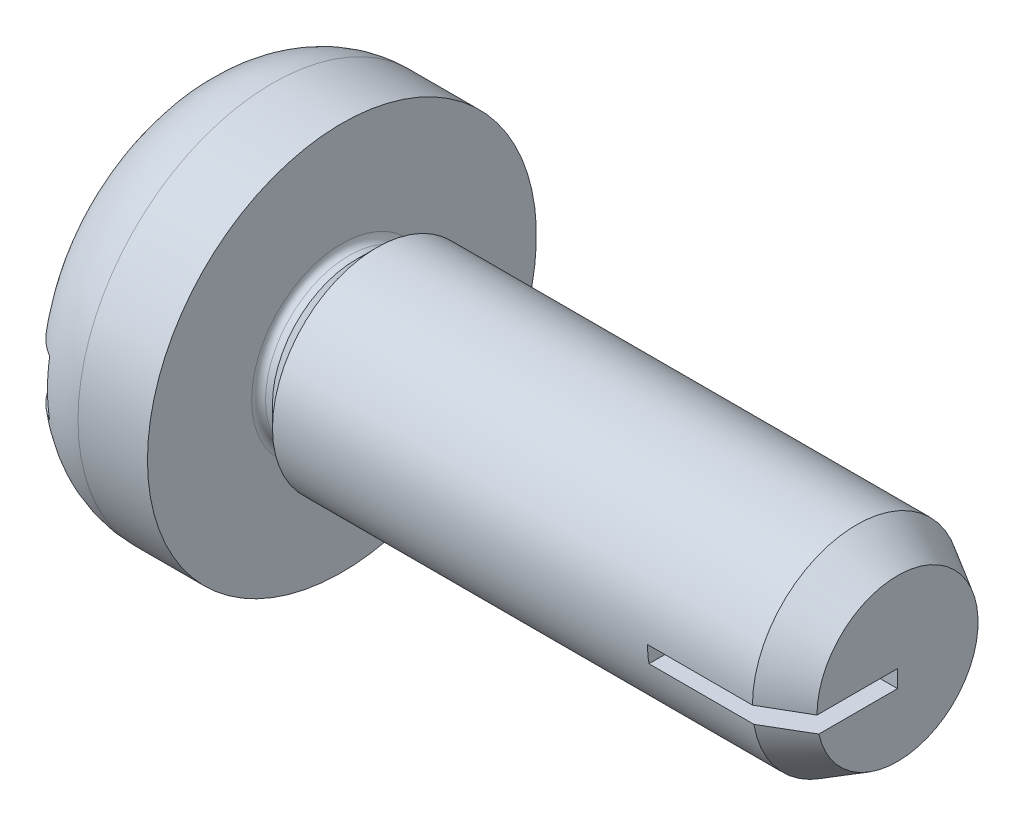
ISO-10303-21;
HEADER;
FILE_DESCRIPTION(('STEP AP214'),'2;1');
FILE_NAME('part.step','',(''),(''),'','','');
FILE_SCHEMA(('AUTOMOTIVE_DESIGN { 1 0 10303 214 1 1 1 1 }'));
ENDSEC;
DATA;
#1=APPLICATION_CONTEXT('core data for automotive mechanical design processes');
#2=APPLICATION_PROTOCOL_DEFINITION('international standard','automotive_design',2000,#1);
#3=PRODUCT_CONTEXT('',#1,'mechanical');
#4=PRODUCT('Part','Part','',(#3));
#5=PRODUCT_RELATED_PRODUCT_CATEGORY('part','',(#4));
#6=PRODUCT_DEFINITION_FORMATION('','',#4);
#7=PRODUCT_DEFINITION_CONTEXT('part definition',#1,'design');
#8=PRODUCT_DEFINITION('design','',#6,#7);
#9=PRODUCT_DEFINITION_SHAPE('','',#8);
#10=(LENGTH_UNIT() NAMED_UNIT(*) SI_UNIT(.MILLI.,.METRE.));
#11=(NAMED_UNIT(*) PLANE_ANGLE_UNIT() SI_UNIT($,.RADIAN.));
#12=(NAMED_UNIT(*) SI_UNIT($,.STERADIAN.) SOLID_ANGLE_UNIT());
#13=UNCERTAINTY_MEASURE_WITH_UNIT(LENGTH_MEASURE(1.E-05),#10,'distance_accuracy_value','');
#14=(GEOMETRIC_REPRESENTATION_CONTEXT(3) GLOBAL_UNCERTAINTY_ASSIGNED_CONTEXT((#13)) GLOBAL_UNIT_ASSIGNED_CONTEXT((#10,
#11,#12)) REPRESENTATION_CONTEXT('',''));
#15=CARTESIAN_POINT('',(0.,0.,0.));
#16=DIRECTION('',(0.,0.,1.));
#17=DIRECTION('',(1.,0.,0.));
#18=AXIS2_PLACEMENT_3D('',#15,#16,#17);
#19=CARTESIAN_POINT('',(0.,0.,0.));
#20=DIRECTION('',(-1.,0.,0.));
#21=DIRECTION('',(0.,0.,1.));
#22=AXIS2_PLACEMENT_3D('',#19,#20,#21);
#23=CYLINDRICAL_SURFACE('',#22,1.5);
#24=CARTESIAN_POINT('',(2.7,0.,0.));
#25=DIRECTION('',(-1.,0.,0.));
#26=DIRECTION('',(0.,0.,1.));
#27=AXIS2_PLACEMENT_3D('',#24,#25,#26);
#28=CIRCLE('',#27,1.5);
#29=CARTESIAN_POINT('',(2.7,0.,1.5));
#30=VERTEX_POINT('',#29);
#31=EDGE_CURVE('E190',#30,#30,#28,.T.);
#32=ORIENTED_EDGE('',*,*,#31,.F.);
#33=EDGE_LOOP('',(#32));
#34=FACE_BOUND('',#33,.T.);
#35=DIRECTION('',(-1.,0.,0.));
#36=VECTOR('',#35,1.);
#37=CARTESIAN_POINT('',(0.,0.,1.5));
#38=LINE('',#37,#36);
#39=CARTESIAN_POINT('',(9.61110272542657,0.,1.5));
#40=VERTEX_POINT('',#39);
#41=CARTESIAN_POINT('',(8.1,0.,1.5));
#42=VERTEX_POINT('',#41);
#43=EDGE_CURVE('E294',#40,#42,#38,.T.);
#44=ORIENTED_EDGE('',*,*,#43,.F.);
#45=CARTESIAN_POINT('',(9.61110272542657,0.,0.));
#46=DIRECTION('',(-1.,0.,0.));
#47=DIRECTION('',(0.,0.,1.));
#48=AXIS2_PLACEMENT_3D('',#45,#46,#47);
#49=CIRCLE('',#48,1.5);
#50=CARTESIAN_POINT('',(9.61110272542657,-0.25,1.4790199457749));
#51=VERTEX_POINT('',#50);
#52=EDGE_CURVE('E290',#40,#51,#49,.T.);
#53=ORIENTED_EDGE('',*,*,#52,.T.);
#54=DIRECTION('',(-1.,0.,0.));
#55=VECTOR('',#54,1.);
#56=CARTESIAN_POINT('',(0.,-0.250000000000001,1.4790199457749));
#57=LINE('',#56,#55);
#58=CARTESIAN_POINT('',(8.1,-0.25,1.4790199457749));
#59=VERTEX_POINT('',#58);
#60=EDGE_CURVE('E300',#59,#51,#57,.F.);
#61=ORIENTED_EDGE('',*,*,#60,.F.);
#62=CARTESIAN_POINT('',(8.1,0.,0.));
#63=DIRECTION('',(1.,0.,0.));
#64=DIRECTION('',(0.,0.,-1.));
#65=AXIS2_PLACEMENT_3D('',#62,#63,#64);
#66=CIRCLE('',#65,1.5);
#67=EDGE_CURVE('E52',#42,#59,#66,.T.);
#68=ORIENTED_EDGE('',*,*,#67,.F.);
#69=EDGE_LOOP('',(#44,#53,#61,#68));
#70=FACE_BOUND('',#69,.T.);
#71=ADVANCED_FACE('F80',(#34,#70),#23,.T.);
#72=CARTESIAN_POINT('',(9.61110272542657,0.,0.));
#73=DIRECTION('',(-1.,0.,0.));
#74=DIRECTION('',(0.,0.,1.));
#75=AXIS2_PLACEMENT_3D('',#72,#73,#74);
#76=CONICAL_SURFACE('',#75,1.5,0.523598775598292);
#77=ORIENTED_EDGE('',*,*,#52,.F.);
#78=DIRECTION('',(-0.866025403784442,0.,0.499999999999994));
#79=VECTOR('',#78,1.);
#80=CARTESIAN_POINT('',(12.2091789367799,0.,0.));
#81=LINE('',#80,#79);
#82=CARTESIAN_POINT('',(10.2,0.,1.16));
#83=VERTEX_POINT('',#82);
#84=EDGE_CURVE('E297',#40,#83,#81,.F.);
#85=ORIENTED_EDGE('',*,*,#84,.T.);
#86=CARTESIAN_POINT('',(10.2,0.,0.));
#87=DIRECTION('',(-1.,0.,0.));
#88=DIRECTION('',(0.,0.,1.));
#89=AXIS2_PLACEMENT_3D('',#86,#87,#88);
#90=CIRCLE('',#89,1.16);
#91=CARTESIAN_POINT('',(10.2,-0.25,1.13274004078606));
#92=VERTEX_POINT('',#91);
#93=EDGE_CURVE('E172',#83,#92,#90,.T.);
#94=ORIENTED_EDGE('',*,*,#93,.T.);
#95=CARTESIAN_POINT('',(11.4181418569732,-0.25,0.382203986386484));
#96=CARTESIAN_POINT('',(11.3972331951244,-0.25,0.396622432472532));
#97=CARTESIAN_POINT('',(11.3762173616021,-0.25,0.410883489403973));
#98=CARTESIAN_POINT('',(11.3340175932902,-0.25,0.439152569856274));
#99=CARTESIAN_POINT('',(11.3128336672864,-0.25,0.453160606478109));
#100=CARTESIAN_POINT('',(11.2491017012437,-0.25,0.494896164896427));
#101=CARTESIAN_POINT('',(11.2063676697051,-0.25,0.522339085516597));
#102=CARTESIAN_POINT('',(11.1206044012544,-0.25,0.576735461075968));
#103=CARTESIAN_POINT('',(11.0775752335605,-0.25,0.603689025716696));
#104=CARTESIAN_POINT('',(10.9913095492911,-0.25,0.657266142328873));
#105=CARTESIAN_POINT('',(10.9480730235488,-0.25,0.683889679520686));
#106=CARTESIAN_POINT('',(10.8218598791878,-0.25,0.761143065792756));
#107=CARTESIAN_POINT('',(10.7386947451298,-0.25,0.81146450763557));
#108=CARTESIAN_POINT('',(10.5720741029365,-0.25,0.911624729010411));
#109=CARTESIAN_POINT('',(10.488618591502,-0.25,0.961463503033986));
#110=CARTESIAN_POINT('',(10.23795252732,-0.25,1.11055290730823));
#111=CARTESIAN_POINT('',(10.0704761356872,-0.25,1.20935625450731));
#112=CARTESIAN_POINT('',(9.77526163481782,-0.25,1.3828718387951));
#113=CARTESIAN_POINT('',(9.64759083644122,-0.25,1.45769905707308));
#114=CARTESIAN_POINT('',(9.39212620609127,-0.25,1.60714336352689));
#115=CARTESIAN_POINT('',(9.26433237410953,-0.25,1.68176045168836));
#116=CARTESIAN_POINT('',(9.0087172173291,-0.25,1.83082709807697));
#117=CARTESIAN_POINT('',(8.88089592520653,-0.25,1.90527671238543));
#118=CARTESIAN_POINT('',(8.62519555777105,-0.25,2.05407620843158));
#119=CARTESIAN_POINT('',(8.49731648254642,-0.25,2.12842609032095));
#120=CARTESIAN_POINT('',(8.36941931140605,-0.25,2.20274480142775));
#121=B_SPLINE_CURVE_WITH_KNOTS('',3,(#95,#96,#97,#98,#99,#100,#101,#102,#103,#104,#105,#106,
#107,#108,#109,#110,#111,#112,#113,#114,#115,#116,#117,#118,#119,#120),.UNSPECIFIED.,.F.,.F.,(4,
2,2,2,2,2,2,2,2,2,2,2,4),(0.,0.0761919627966669,0.152379969123876,0.304734924671154,
0.457055293432604,0.609382459099721,0.900992098244172,1.19260506147505,1.77594908814433,
2.2198978958494,2.6638467338862,3.10761381509469,3.55138022062236),.UNSPECIFIED.);
#122=EDGE_CURVE('E303',#92,#51,#121,.T.);
#123=ORIENTED_EDGE('',*,*,#122,.T.);
#124=EDGE_LOOP('',(#77,#85,#94,#123));
#125=FACE_BOUND('',#124,.T.);
#126=ADVANCED_FACE('F247',(#125),#76,.T.);
#127=CARTESIAN_POINT('',(10.2,1.5,0.));
#128=DIRECTION('',(-1.,0.,0.));
#129=DIRECTION('',(0.,0.,1.));
#130=AXIS2_PLACEMENT_3D('',#127,#128,#129);
#131=PLANE('',#130);
#132=DIRECTION('',(0.,0.,1.));
#133=VECTOR('',#132,1.);
#134=CARTESIAN_POINT('',(10.2,0.,0.));
#135=LINE('',#134,#133);
#136=CARTESIAN_POINT('',(10.2,0.,0.));
#137=VERTEX_POINT('',#136);
#138=EDGE_CURVE('E89',#137,#83,#135,.T.);
#139=ORIENTED_EDGE('',*,*,#138,.F.);
#140=DIRECTION('',(0.,1.,0.));
#141=VECTOR('',#140,1.);
#142=CARTESIAN_POINT('',(10.2,0.,0.));
#143=LINE('',#142,#141);
#144=CARTESIAN_POINT('',(10.2,-0.25,0.));
#145=VERTEX_POINT('',#144);
#146=EDGE_CURVE('E162',#145,#137,#143,.T.);
#147=ORIENTED_EDGE('',*,*,#146,.F.);
#148=DIRECTION('',(0.,0.,-1.));
#149=VECTOR('',#148,1.);
#150=CARTESIAN_POINT('',(10.2,-0.25,0.));
#151=LINE('',#150,#149);
#152=EDGE_CURVE('E174',#92,#145,#151,.T.);
#153=ORIENTED_EDGE('',*,*,#152,.F.);
#154=ORIENTED_EDGE('',*,*,#93,.F.);
#155=EDGE_LOOP('',(#139,#147,#153,#154));
#156=FACE_BOUND('',#155,.T.);
#157=ADVANCED_FACE('F82',(#156),#131,.F.);
#158=CARTESIAN_POINT('',(0.,0.,0.));
#159=DIRECTION('',(1.,0.,0.));
#160=DIRECTION('',(0.,0.,-1.));
#161=AXIS2_PLACEMENT_3D('',#158,#159,#160);
#162=PLANE('',#161);
#163=CARTESIAN_POINT('',(0.,0.,0.));
#164=DIRECTION('',(-1.,0.,0.));
#165=DIRECTION('',(0.,0.,1.));
#166=AXIS2_PLACEMENT_3D('',#163,#164,#165);
#167=CIRCLE('',#166,1.6);
#168=CARTESIAN_POINT('',(0.,0.4,1.54919333848297));
#169=VERTEX_POINT('',#168);
#170=CARTESIAN_POINT('',(0.,0.4,-1.54919333848297));
#171=VERTEX_POINT('',#170);
#172=EDGE_CURVE('E214',#169,#171,#167,.T.);
#173=ORIENTED_EDGE('',*,*,#172,.T.);
#174=DIRECTION('',(0.,0.,1.));
#175=VECTOR('',#174,1.);
#176=CARTESIAN_POINT('',(0.,0.4,0.));
#177=LINE('',#176,#175);
#178=EDGE_CURVE('E183',#171,#169,#177,.T.);
#179=ORIENTED_EDGE('',*,*,#178,.T.);
#180=EDGE_LOOP('',(#173,#179));
#181=FACE_BOUND('',#180,.T.);
#182=ADVANCED_FACE('F337',(#181),#162,.F.);
#183=CARTESIAN_POINT('',(2.7,0.,0.));
#184=DIRECTION('',(1.,0.,0.));
#185=DIRECTION('',(0.,0.,-1.));
#186=AXIS2_PLACEMENT_3D('',#183,#184,#185);
#187=CONICAL_SURFACE('',#186,1.5,0.78539816339745);
#188=CARTESIAN_POINT('',(2.4,0.,0.));
#189=DIRECTION('',(-1.,0.,0.));
#190=DIRECTION('',(0.,0.,1.));
#191=AXIS2_PLACEMENT_3D('',#188,#189,#190);
#192=CIRCLE('',#191,1.2);
#193=CARTESIAN_POINT('',(2.4,0.,1.2));
#194=VERTEX_POINT('',#193);
#195=EDGE_CURVE('E194',#194,#194,#192,.T.);
#196=ORIENTED_EDGE('',*,*,#195,.F.);
#197=EDGE_LOOP('',(#196));
#198=FACE_BOUND('',#197,.T.);
#199=ORIENTED_EDGE('',*,*,#31,.T.);
#200=EDGE_LOOP('',(#199));
#201=FACE_BOUND('',#200,.T.);
#202=ADVANCED_FACE('F333',(#198,#201),#187,.T.);
#203=CARTESIAN_POINT('',(0.,0.,0.));
#204=DIRECTION('',(-1.,0.,0.));
#205=DIRECTION('',(0.,0.,1.));
#206=AXIS2_PLACEMENT_3D('',#203,#204,#205);
#207=CYLINDRICAL_SURFACE('',#206,1.2);
#208=CARTESIAN_POINT('',(2.3,0.,0.));
#209=DIRECTION('',(-1.,0.,0.));
#210=DIRECTION('',(0.,0.,1.));
#211=AXIS2_PLACEMENT_3D('',#208,#209,#210);
#212=CIRCLE('',#211,1.2);
#213=CARTESIAN_POINT('',(2.3,0.,1.2));
#214=VERTEX_POINT('',#213);
#215=EDGE_CURVE('E198',#214,#214,#212,.T.);
#216=ORIENTED_EDGE('',*,*,#215,.F.);
#217=EDGE_LOOP('',(#216));
#218=FACE_BOUND('',#217,.T.);
#219=ORIENTED_EDGE('',*,*,#195,.T.);
#220=EDGE_LOOP('',(#219));
#221=FACE_BOUND('',#220,.T.);
#222=ADVANCED_FACE('F336',(#218,#221),#207,.T.);
#223=CARTESIAN_POINT('',(2.3,0.,0.));
#224=DIRECTION('',(-1.,0.,0.));
#225=DIRECTION('',(0.,0.,1.));
#226=AXIS2_PLACEMENT_3D('',#223,#224,#225);
#227=TOROIDAL_SURFACE('',#226,1.3,0.0999999999999997);
#228=CARTESIAN_POINT('',(2.2,0.,0.));
#229=DIRECTION('',(-1.,0.,0.));
#230=DIRECTION('',(0.,0.,1.));
#231=AXIS2_PLACEMENT_3D('',#228,#229,#230);
#232=CIRCLE('',#231,1.3);
#233=CARTESIAN_POINT('',(2.2,0.,1.3));
#234=VERTEX_POINT('',#233);
#235=EDGE_CURVE('E202',#234,#234,#232,.T.);
#236=ORIENTED_EDGE('',*,*,#235,.F.);
#237=EDGE_LOOP('',(#236));
#238=FACE_BOUND('',#237,.T.);
#239=ORIENTED_EDGE('',*,*,#215,.T.);
#240=EDGE_LOOP('',(#239));
#241=FACE_BOUND('',#240,.T.);
#242=ADVANCED_FACE('F341',(#238,#241),#227,.F.);
#243=CARTESIAN_POINT('',(2.2,2.8,0.));
#244=DIRECTION('',(-1.,0.,0.));
#245=DIRECTION('',(0.,0.,1.));
#246=AXIS2_PLACEMENT_3D('',#243,#244,#245);
#247=PLANE('',#246);
#248=CARTESIAN_POINT('',(2.2,0.,0.));
#249=DIRECTION('',(-1.,0.,0.));
#250=DIRECTION('',(0.,0.,1.));
#251=AXIS2_PLACEMENT_3D('',#248,#249,#250);
#252=CIRCLE('',#251,2.8);
#253=CARTESIAN_POINT('',(2.2,0.,2.8));
#254=VERTEX_POINT('',#253);
#255=EDGE_CURVE('E206',#254,#254,#252,.T.);
#256=ORIENTED_EDGE('',*,*,#255,.F.);
#257=EDGE_LOOP('',(#256));
#258=FACE_BOUND('',#257,.T.);
#259=ORIENTED_EDGE('',*,*,#235,.T.);
#260=EDGE_LOOP('',(#259));
#261=FACE_BOUND('',#260,.T.);
#262=ADVANCED_FACE('F345',(#258,#261),#247,.F.);
#263=CARTESIAN_POINT('',(0.,0.,0.));
#264=DIRECTION('',(-1.,0.,0.));
#265=DIRECTION('',(0.,0.,1.));
#266=AXIS2_PLACEMENT_3D('',#263,#264,#265);
#267=CYLINDRICAL_SURFACE('',#266,2.8);
#268=CARTESIAN_POINT('',(1.2,0.,0.));
#269=DIRECTION('',(-1.,0.,0.));
#270=DIRECTION('',(0.,0.,1.));
#271=AXIS2_PLACEMENT_3D('',#268,#269,#270);
#272=CIRCLE('',#271,2.8);
#273=CARTESIAN_POINT('',(1.2,0.,2.8));
#274=VERTEX_POINT('',#273);
#275=EDGE_CURVE('E210',#274,#274,#272,.T.);
#276=ORIENTED_EDGE('',*,*,#275,.F.);
#277=EDGE_LOOP('',(#276));
#278=FACE_BOUND('',#277,.T.);
#279=ORIENTED_EDGE('',*,*,#255,.T.);
#280=EDGE_LOOP('',(#279));
#281=FACE_BOUND('',#280,.T.);
#282=ADVANCED_FACE('F348',(#278,#281),#267,.T.);
#283=CARTESIAN_POINT('',(1.2,0.,0.));
#284=DIRECTION('',(-1.,0.,0.));
#285=DIRECTION('',(0.,0.,1.));
#286=AXIS2_PLACEMENT_3D('',#283,#284,#285);
#287=TOROIDAL_SURFACE('',#286,1.6,1.2);
#288=CARTESIAN_POINT('',(0.6,0.,0.));
#289=DIRECTION('',(1.,0.,0.));
#290=DIRECTION('',(0.,0.,-1.));
#291=AXIS2_PLACEMENT_3D('',#288,#289,#290);
#292=CIRCLE('',#291,2.63923048454133);
#293=CARTESIAN_POINT('',(0.6,-0.4,-2.60874252285124));
#294=VERTEX_POINT('',#293);
#295=CARTESIAN_POINT('',(0.6,0.4,-2.60874252285124));
#296=VERTEX_POINT('',#295);
#297=EDGE_CURVE('E176',#294,#296,#292,.T.);
#298=ORIENTED_EDGE('',*,*,#297,.T.);
#299=CARTESIAN_POINT('',(1.2,0.4,0.));
#300=CARTESIAN_POINT('',(1.19800002214789,0.4,-0.00115466698871855));
#301=CARTESIAN_POINT('',(1.1960000217345,0.4,-0.00230936827193281));
#302=CARTESIAN_POINT('',(1.07851992928523,0.399999999999999,-0.0701402646469924));
#303=CARTESIAN_POINT('',(0.963031267984437,0.4,-0.137031551756192));
#304=CARTESIAN_POINT('',(0.795628563220693,0.4,-0.246377030383225));
#305=CARTESIAN_POINT('',(0.740832436729923,0.4,-0.284299922840263));
#306=CARTESIAN_POINT('',(0.634300385450462,0.4,-0.364194759563207));
#307=CARTESIAN_POINT('',(0.582562679504804,0.4,-0.406164308913304));
#308=CARTESIAN_POINT('',(0.465619274423474,0.4,-0.510755553519521));
#309=CARTESIAN_POINT('',(0.402179968317596,0.4,-0.57540879176858));
#310=CARTESIAN_POINT('',(0.286317320035686,0.4,-0.714106368628982));
#311=CARTESIAN_POINT('',(0.233897735017528,0.4,-0.788153896456479));
#312=CARTESIAN_POINT('',(0.142797670168301,0.4,-0.945320815266712));
#313=CARTESIAN_POINT('',(0.104252175689236,0.4,-1.02851956722977));
#314=CARTESIAN_POINT('',(0.0443409897927813,0.4,-1.20092725682624));
#315=CARTESIAN_POINT('',(0.0229636760970945,0.4,-1.29013208413619));
#316=CARTESIAN_POINT('',(0.000858314142152574,0.4,-1.4582761752739));
#317=CARTESIAN_POINT('',(-0.00235235719653778,0.4,-1.53689338760874));
#318=CARTESIAN_POINT('',(0.00576054949015224,0.4,-1.69337597661939));
#319=CARTESIAN_POINT('',(0.0170759813003484,0.4,-1.77124175003619));
#320=CARTESIAN_POINT('',(0.0525610257881557,0.4,-1.91696976554059));
#321=CARTESIAN_POINT('',(0.0755565891225386,0.4,-1.9851197953842));
#322=CARTESIAN_POINT('',(0.133093509111277,0.4,-2.11635517467466));
#323=CARTESIAN_POINT('',(0.167631267407019,0.4,-2.17944209498844));
#324=CARTESIAN_POINT('',(0.245816751592905,0.4,-2.29633028651693));
#325=CARTESIAN_POINT('',(0.28908094915115,0.4,-2.35038843477007));
#326=CARTESIAN_POINT('',(0.38422833741794,0.4,-2.45030606079158));
#327=CARTESIAN_POINT('',(0.436111208507158,0.4,-2.49616584246151));
#328=CARTESIAN_POINT('',(0.54597581646141,0.4,-2.5775197041791));
#329=CARTESIAN_POINT('',(0.603828386265241,0.4,-2.61318831704883));
#330=CARTESIAN_POINT('',(0.724733603956612,0.4,-2.67419425683942));
#331=CARTESIAN_POINT('',(0.787785087346299,0.4,-2.69953388981796));
#332=CARTESIAN_POINT('',(0.91666946627424,0.4,-2.73894273624227));
#333=CARTESIAN_POINT('',(0.982470675322364,0.4,-2.75311557094143));
#334=CARTESIAN_POINT('',(1.1155255636707,0.4,-2.7701715048585));
#335=CARTESIAN_POINT('',(1.18277950768768,0.4,-2.77305252873677));
#336=CARTESIAN_POINT('',(1.31654922365011,0.4,-2.76743242821687));
#337=CARTESIAN_POINT('',(1.3830669354009,0.4,-2.75898086367109));
#338=CARTESIAN_POINT('',(1.48103311703034,0.4,-2.73804449298601));
#339=CARTESIAN_POINT('',(1.51341191586074,0.4,-2.72967920848576));
#340=CARTESIAN_POINT('',(1.5773527652736,0.4,-2.71025505840752));
#341=CARTESIAN_POINT('',(1.60891478219557,0.4,-2.69919608201444));
#342=CARTESIAN_POINT('',(1.63997012604846,0.4,-2.68682286567703));
#343=B_SPLINE_CURVE_WITH_KNOTS('',3,(#299,#300,#301,#302,#303,#304,#305,#306,#307,#308,#309,
#310,#311,#312,#313,#314,#315,#316,#317,#318,#319,#320,#321,#322,#323,#324,#325,#326,#327,#328,
#329,#330,#331,#332,#333,#334,#335,#336,#337,#338,#339,#340,#341,#342),.UNSPECIFIED.,.F.,.F.,(4,
2,2,2,2,2,2,2,2,2,2,2,2,2,2,2,2,2,2,2,2,4),(0.,0.00692820323037692,0.406962370716071,
0.606725059471952,0.806370240836196,1.0771229989525,1.34796792064431,1.62138096078601,
1.89460875314745,2.12938467138175,2.36402898515836,2.57873345497427,2.79337105154141,
3.00008219626894,3.20678567692457,3.40970176105923,3.61257251711377,3.81353782319069,
4.01454006326545,4.21466613793784,4.31488940223465,4.41511679028649),.UNSPECIFIED.);
#344=EDGE_CURVE('E229',#296,#171,#343,.F.);
#345=ORIENTED_EDGE('',*,*,#344,.T.);
#346=ORIENTED_EDGE('',*,*,#172,.F.);
#347=CARTESIAN_POINT('',(1.2,0.4,0.));
#348=CARTESIAN_POINT('',(1.19800002214789,0.4,0.00115466698871855));
#349=CARTESIAN_POINT('',(1.1960000217345,0.4,0.00230936827193281));
#350=CARTESIAN_POINT('',(1.07851992928523,0.399999999999999,0.0701402646469924));
#351=CARTESIAN_POINT('',(0.963031267984437,0.4,0.137031551756192));
#352=CARTESIAN_POINT('',(0.795628563220693,0.4,0.246377030383225));
#353=CARTESIAN_POINT('',(0.740832436729923,0.4,0.284299922840263));
#354=CARTESIAN_POINT('',(0.634300385450462,0.4,0.364194759563207));
#355=CARTESIAN_POINT('',(0.582562679504804,0.4,0.406164308913304));
#356=CARTESIAN_POINT('',(0.465619274423474,0.4,0.510755553519521));
#357=CARTESIAN_POINT('',(0.402179968317596,0.4,0.57540879176858));
#358=CARTESIAN_POINT('',(0.286317320035686,0.4,0.714106368628982));
#359=CARTESIAN_POINT('',(0.233897735017528,0.4,0.788153896456479));
#360=CARTESIAN_POINT('',(0.142797670168301,0.4,0.945320815266712));
#361=CARTESIAN_POINT('',(0.104252175689236,0.4,1.02851956722977));
#362=CARTESIAN_POINT('',(0.0443409897927813,0.4,1.20092725682624));
#363=CARTESIAN_POINT('',(0.0229636760970945,0.4,1.29013208413619));
#364=CARTESIAN_POINT('',(0.000858314142152574,0.4,1.4582761752739));
#365=CARTESIAN_POINT('',(-0.00235235719653778,0.4,1.53689338760874));
#366=CARTESIAN_POINT('',(0.00576054949015224,0.4,1.69337597661939));
#367=CARTESIAN_POINT('',(0.0170759813003484,0.4,1.77124175003619));
#368=CARTESIAN_POINT('',(0.0525610257881557,0.4,1.91696976554059));
#369=CARTESIAN_POINT('',(0.0755565891225386,0.4,1.9851197953842));
#370=CARTESIAN_POINT('',(0.133093509111277,0.4,2.11635517467466));
#371=CARTESIAN_POINT('',(0.167631267407019,0.4,2.17944209498844));
#372=CARTESIAN_POINT('',(0.245816751592905,0.4,2.29633028651693));
#373=CARTESIAN_POINT('',(0.28908094915115,0.4,2.35038843477007));
#374=CARTESIAN_POINT('',(0.38422833741794,0.4,2.45030606079158));
#375=CARTESIAN_POINT('',(0.436111208507158,0.4,2.49616584246151));
#376=CARTESIAN_POINT('',(0.54597581646141,0.4,2.5775197041791));
#377=CARTESIAN_POINT('',(0.603828386265241,0.4,2.61318831704883));
#378=CARTESIAN_POINT('',(0.724733603956612,0.4,2.67419425683942));
#379=CARTESIAN_POINT('',(0.787785087346299,0.4,2.69953388981796));
#380=CARTESIAN_POINT('',(0.91666946627424,0.4,2.73894273624227));
#381=CARTESIAN_POINT('',(0.982470675322364,0.4,2.75311557094143));
#382=CARTESIAN_POINT('',(1.1155255636707,0.4,2.7701715048585));
#383=CARTESIAN_POINT('',(1.18277950768768,0.4,2.77305252873677));
#384=CARTESIAN_POINT('',(1.31654922365011,0.4,2.76743242821687));
#385=CARTESIAN_POINT('',(1.3830669354009,0.4,2.75898086367109));
#386=CARTESIAN_POINT('',(1.48103311703034,0.4,2.73804449298601));
#387=CARTESIAN_POINT('',(1.51341191586074,0.4,2.72967920848576));
#388=CARTESIAN_POINT('',(1.5773527652736,0.4,2.71025505840752));
#389=CARTESIAN_POINT('',(1.60891478219557,0.4,2.69919608201444));
#390=CARTESIAN_POINT('',(1.63997012604846,0.4,2.68682286567703));
#391=B_SPLINE_CURVE_WITH_KNOTS('',3,(#347,#348,#349,#350,#351,#352,#353,#354,#355,#356,#357,
#358,#359,#360,#361,#362,#363,#364,#365,#366,#367,#368,#369,#370,#371,#372,#373,#374,#375,#376,
#377,#378,#379,#380,#381,#382,#383,#384,#385,#386,#387,#388,#389,#390),.UNSPECIFIED.,.F.,.F.,(4,
2,2,2,2,2,2,2,2,2,2,2,2,2,2,2,2,2,2,2,2,4),(0.,0.00692820323037692,0.406962370716071,
0.606725059471952,0.806370240836196,1.0771229989525,1.34796792064431,1.62138096078601,
1.89460875314745,2.12938467138175,2.36402898515836,2.57873345497427,2.79337105154141,
3.00008219626894,3.20678567692457,3.40970176105923,3.61257251711377,3.81353782319069,
4.01454006326545,4.21466613793784,4.31488940223465,4.41511679028649),.UNSPECIFIED.);
#392=CARTESIAN_POINT('',(0.6,0.4,2.60874252285124));
#393=VERTEX_POINT('',#392);
#394=EDGE_CURVE('E219',#169,#393,#391,.T.);
#395=ORIENTED_EDGE('',*,*,#394,.T.);
#396=CARTESIAN_POINT('',(0.6,-0.4,2.60874252285124));
#397=VERTEX_POINT('',#396);
#398=EDGE_CURVE('E179',#393,#397,#292,.T.);
#399=ORIENTED_EDGE('',*,*,#398,.T.);
#400=CARTESIAN_POINT('',(1.2,-0.4,0.));
#401=CARTESIAN_POINT('',(1.19800002214789,-0.4,0.00115466698871855));
#402=CARTESIAN_POINT('',(1.1960000217345,-0.4,0.00230936827193281));
#403=CARTESIAN_POINT('',(1.07851992928523,-0.399999999999999,0.0701402646469924));
#404=CARTESIAN_POINT('',(0.963031267984437,-0.4,0.137031551756192));
#405=CARTESIAN_POINT('',(0.795628563220693,-0.4,0.246377030383225));
#406=CARTESIAN_POINT('',(0.740832436729923,-0.4,0.284299922840263));
#407=CARTESIAN_POINT('',(0.634300385450462,-0.4,0.364194759563207));
#408=CARTESIAN_POINT('',(0.582562679504804,-0.4,0.406164308913304));
#409=CARTESIAN_POINT('',(0.465619274423474,-0.4,0.510755553519521));
#410=CARTESIAN_POINT('',(0.402179968317596,-0.4,0.57540879176858));
#411=CARTESIAN_POINT('',(0.286317320035686,-0.4,0.714106368628982));
#412=CARTESIAN_POINT('',(0.233897735017528,-0.4,0.788153896456479));
#413=CARTESIAN_POINT('',(0.142797670168301,-0.4,0.945320815266712));
#414=CARTESIAN_POINT('',(0.104252175689236,-0.4,1.02851956722977));
#415=CARTESIAN_POINT('',(0.0443409897927813,-0.4,1.20092725682624));
#416=CARTESIAN_POINT('',(0.0229636760970945,-0.4,1.29013208413619));
#417=CARTESIAN_POINT('',(0.000858314142152574,-0.4,1.4582761752739));
#418=CARTESIAN_POINT('',(-0.00235235719653778,-0.4,1.53689338760874));
#419=CARTESIAN_POINT('',(0.00576054949015224,-0.4,1.69337597661939));
#420=CARTESIAN_POINT('',(0.0170759813003484,-0.4,1.77124175003619));
#421=CARTESIAN_POINT('',(0.0525610257881557,-0.4,1.91696976554059));
#422=CARTESIAN_POINT('',(0.0755565891225386,-0.4,1.9851197953842));
#423=CARTESIAN_POINT('',(0.133093509111277,-0.4,2.11635517467466));
#424=CARTESIAN_POINT('',(0.167631267407019,-0.4,2.17944209498844));
#425=CARTESIAN_POINT('',(0.245816751592905,-0.4,2.29633028651693));
#426=CARTESIAN_POINT('',(0.28908094915115,-0.4,2.35038843477007));
#427=CARTESIAN_POINT('',(0.38422833741794,-0.4,2.45030606079158));
#428=CARTESIAN_POINT('',(0.436111208507158,-0.4,2.49616584246151));
#429=CARTESIAN_POINT('',(0.54597581646141,-0.4,2.5775197041791));
#430=CARTESIAN_POINT('',(0.603828386265241,-0.4,2.61318831704883));
#431=CARTESIAN_POINT('',(0.724733603956612,-0.4,2.67419425683942));
#432=CARTESIAN_POINT('',(0.787785087346299,-0.4,2.69953388981796));
#433=CARTESIAN_POINT('',(0.91666946627424,-0.4,2.73894273624227));
#434=CARTESIAN_POINT('',(0.982470675322364,-0.4,2.75311557094143));
#435=CARTESIAN_POINT('',(1.1155255636707,-0.4,2.7701715048585));
#436=CARTESIAN_POINT('',(1.18277950768768,-0.4,2.77305252873677));
#437=CARTESIAN_POINT('',(1.31654922365011,-0.4,2.76743242821687));
#438=CARTESIAN_POINT('',(1.3830669354009,-0.4,2.75898086367109));
#439=CARTESIAN_POINT('',(1.48103311703034,-0.4,2.73804449298601));
#440=CARTESIAN_POINT('',(1.51341191586074,-0.4,2.72967920848576));
#441=CARTESIAN_POINT('',(1.5773527652736,-0.4,2.71025505840752));
#442=CARTESIAN_POINT('',(1.60891478219557,-0.4,2.69919608201444));
#443=CARTESIAN_POINT('',(1.63997012604846,-0.4,2.68682286567703));
#444=B_SPLINE_CURVE_WITH_KNOTS('',3,(#400,#401,#402,#403,#404,#405,#406,#407,#408,#409,#410,
#411,#412,#413,#414,#415,#416,#417,#418,#419,#420,#421,#422,#423,#424,#425,#426,#427,#428,#429,
#430,#431,#432,#433,#434,#435,#436,#437,#438,#439,#440,#441,#442,#443),.UNSPECIFIED.,.F.,.F.,(4,
2,2,2,2,2,2,2,2,2,2,2,2,2,2,2,2,2,2,2,2,4),(0.,0.00692820323037692,0.406962370716071,
0.606725059471952,0.806370240836196,1.0771229989525,1.34796792064431,1.62138096078601,
1.89460875314745,2.12938467138175,2.36402898515836,2.57873345497427,2.79337105154141,
3.00008219626894,3.20678567692457,3.40970176105923,3.61257251711377,3.81353782319069,
4.01454006326545,4.21466613793784,4.31488940223465,4.41511679028649),.UNSPECIFIED.);
#445=CARTESIAN_POINT('',(0.,-0.4,1.54919333848297));
#446=VERTEX_POINT('',#445);
#447=EDGE_CURVE('E260',#397,#446,#444,.F.);
#448=ORIENTED_EDGE('',*,*,#447,.T.);
#449=CARTESIAN_POINT('',(0.,-0.4,-1.54919333848297));
#450=VERTEX_POINT('',#449);
#451=EDGE_CURVE('E218',#450,#446,#167,.T.);
#452=ORIENTED_EDGE('',*,*,#451,.F.);
#453=CARTESIAN_POINT('',(1.2,-0.4,0.));
#454=CARTESIAN_POINT('',(1.19800002214789,-0.4,-0.00115466698871855));
#455=CARTESIAN_POINT('',(1.1960000217345,-0.4,-0.00230936827193281));
#456=CARTESIAN_POINT('',(1.07851992928523,-0.399999999999999,-0.0701402646469924));
#457=CARTESIAN_POINT('',(0.963031267984437,-0.4,-0.137031551756192));
#458=CARTESIAN_POINT('',(0.795628563220693,-0.4,-0.246377030383225));
#459=CARTESIAN_POINT('',(0.740832436729923,-0.4,-0.284299922840263));
#460=CARTESIAN_POINT('',(0.634300385450462,-0.4,-0.364194759563207));
#461=CARTESIAN_POINT('',(0.582562679504804,-0.4,-0.406164308913304));
#462=CARTESIAN_POINT('',(0.465619274423474,-0.4,-0.510755553519521));
#463=CARTESIAN_POINT('',(0.402179968317596,-0.4,-0.57540879176858));
#464=CARTESIAN_POINT('',(0.286317320035686,-0.4,-0.714106368628982));
#465=CARTESIAN_POINT('',(0.233897735017528,-0.4,-0.788153896456479));
#466=CARTESIAN_POINT('',(0.142797670168301,-0.4,-0.945320815266712));
#467=CARTESIAN_POINT('',(0.104252175689236,-0.4,-1.02851956722977));
#468=CARTESIAN_POINT('',(0.0443409897927813,-0.4,-1.20092725682624));
#469=CARTESIAN_POINT('',(0.0229636760970945,-0.4,-1.29013208413619));
#470=CARTESIAN_POINT('',(0.000858314142152574,-0.4,-1.4582761752739));
#471=CARTESIAN_POINT('',(-0.00235235719653778,-0.4,-1.53689338760874));
#472=CARTESIAN_POINT('',(0.00576054949015224,-0.4,-1.69337597661939));
#473=CARTESIAN_POINT('',(0.0170759813003484,-0.4,-1.77124175003619));
#474=CARTESIAN_POINT('',(0.0525610257881557,-0.4,-1.91696976554059));
#475=CARTESIAN_POINT('',(0.0755565891225386,-0.4,-1.9851197953842));
#476=CARTESIAN_POINT('',(0.133093509111277,-0.4,-2.11635517467466));
#477=CARTESIAN_POINT('',(0.167631267407019,-0.4,-2.17944209498844));
#478=CARTESIAN_POINT('',(0.245816751592905,-0.4,-2.29633028651693));
#479=CARTESIAN_POINT('',(0.28908094915115,-0.4,-2.35038843477007));
#480=CARTESIAN_POINT('',(0.38422833741794,-0.4,-2.45030606079158));
#481=CARTESIAN_POINT('',(0.436111208507158,-0.4,-2.49616584246151));
#482=CARTESIAN_POINT('',(0.54597581646141,-0.4,-2.5775197041791));
#483=CARTESIAN_POINT('',(0.603828386265241,-0.4,-2.61318831704883));
#484=CARTESIAN_POINT('',(0.724733603956612,-0.4,-2.67419425683942));
#485=CARTESIAN_POINT('',(0.787785087346299,-0.4,-2.69953388981796));
#486=CARTESIAN_POINT('',(0.91666946627424,-0.4,-2.73894273624227));
#487=CARTESIAN_POINT('',(0.982470675322364,-0.4,-2.75311557094143));
#488=CARTESIAN_POINT('',(1.1155255636707,-0.4,-2.7701715048585));
#489=CARTESIAN_POINT('',(1.18277950768768,-0.4,-2.77305252873677));
#490=CARTESIAN_POINT('',(1.31654922365011,-0.4,-2.76743242821687));
#491=CARTESIAN_POINT('',(1.3830669354009,-0.4,-2.75898086367109));
#492=CARTESIAN_POINT('',(1.48103311703034,-0.4,-2.73804449298601));
#493=CARTESIAN_POINT('',(1.51341191586074,-0.4,-2.72967920848576));
#494=CARTESIAN_POINT('',(1.5773527652736,-0.4,-2.71025505840752));
#495=CARTESIAN_POINT('',(1.60891478219557,-0.4,-2.69919608201444));
#496=CARTESIAN_POINT('',(1.63997012604846,-0.4,-2.68682286567703));
#497=B_SPLINE_CURVE_WITH_KNOTS('',3,(#453,#454,#455,#456,#457,#458,#459,#460,#461,#462,#463,
#464,#465,#466,#467,#468,#469,#470,#471,#472,#473,#474,#475,#476,#477,#478,#479,#480,#481,#482,
#483,#484,#485,#486,#487,#488,#489,#490,#491,#492,#493,#494,#495,#496),.UNSPECIFIED.,.F.,.F.,(4,
2,2,2,2,2,2,2,2,2,2,2,2,2,2,2,2,2,2,2,2,4),(0.,0.00692820323037692,0.406962370716071,
0.606725059471952,0.806370240836196,1.0771229989525,1.34796792064431,1.62138096078601,
1.89460875314745,2.12938467138175,2.36402898515836,2.57873345497427,2.79337105154141,
3.00008219626894,3.20678567692457,3.40970176105923,3.61257251711377,3.81353782319069,
4.01454006326545,4.21466613793784,4.31488940223465,4.41511679028649),.UNSPECIFIED.);
#498=EDGE_CURVE('E104',#450,#294,#497,.T.);
#499=ORIENTED_EDGE('',*,*,#498,.T.);
#500=EDGE_LOOP('',(#298,#345,#346,#395,#399,#448,#452,#499));
#501=FACE_BOUND('',#500,.T.);
#502=ORIENTED_EDGE('',*,*,#275,.T.);
#503=EDGE_LOOP('',(#502));
#504=FACE_BOUND('',#503,.T.);
#505=ADVANCED_FACE('F235',(#501,#504),#287,.T.);
#506=ORIENTED_EDGE('',*,*,#451,.T.);
#507=DIRECTION('',(0.,0.,-1.));
#508=VECTOR('',#507,1.);
#509=CARTESIAN_POINT('',(0.,-0.4,0.));
#510=LINE('',#509,#508);
#511=EDGE_CURVE('E187',#446,#450,#510,.T.);
#512=ORIENTED_EDGE('',*,*,#511,.T.);
#513=EDGE_LOOP('',(#506,#512));
#514=FACE_BOUND('',#513,.T.);
#515=ADVANCED_FACE('F253',(#514),#162,.F.);
#516=CARTESIAN_POINT('',(0.6,0.4,-2.8));
#517=DIRECTION('',(1.,0.,0.));
#518=DIRECTION('',(0.,0.,-1.));
#519=AXIS2_PLACEMENT_3D('',#516,#517,#518);
#520=PLANE('',#519);
#521=DIRECTION('',(0.,0.,1.));
#522=VECTOR('',#521,1.);
#523=CARTESIAN_POINT('',(0.6,0.4,-2.8));
#524=LINE('',#523,#522);
#525=EDGE_CURVE('E278',#296,#393,#524,.T.);
#526=ORIENTED_EDGE('',*,*,#525,.F.);
#527=ORIENTED_EDGE('',*,*,#297,.F.);
#528=DIRECTION('',(0.,0.,1.));
#529=VECTOR('',#528,1.);
#530=CARTESIAN_POINT('',(0.6,-0.4,-2.8));
#531=LINE('',#530,#529);
#532=EDGE_CURVE('E282',#294,#397,#531,.T.);
#533=ORIENTED_EDGE('',*,*,#532,.T.);
#534=ORIENTED_EDGE('',*,*,#398,.F.);
#535=EDGE_LOOP('',(#526,#527,#533,#534));
#536=FACE_BOUND('',#535,.T.);
#537=ADVANCED_FACE('F245',(#536),#520,.F.);
#538=CARTESIAN_POINT('',(0.,0.4,-2.8));
#539=DIRECTION('',(0.,1.,0.));
#540=DIRECTION('',(0.,0.,1.));
#541=AXIS2_PLACEMENT_3D('',#538,#539,#540);
#542=PLANE('',#541);
#543=ORIENTED_EDGE('',*,*,#178,.F.);
#544=ORIENTED_EDGE('',*,*,#344,.F.);
#545=ORIENTED_EDGE('',*,*,#525,.T.);
#546=ORIENTED_EDGE('',*,*,#394,.F.);
#547=EDGE_LOOP('',(#543,#544,#545,#546));
#548=FACE_BOUND('',#547,.T.);
#549=ADVANCED_FACE('F239',(#548),#542,.F.);
#550=CARTESIAN_POINT('',(0.,-0.4,-2.8));
#551=DIRECTION('',(0.,-1.,0.));
#552=DIRECTION('',(0.,0.,-1.));
#553=AXIS2_PLACEMENT_3D('',#550,#551,#552);
#554=PLANE('',#553);
#555=ORIENTED_EDGE('',*,*,#511,.F.);
#556=ORIENTED_EDGE('',*,*,#447,.F.);
#557=ORIENTED_EDGE('',*,*,#532,.F.);
#558=ORIENTED_EDGE('',*,*,#498,.F.);
#559=EDGE_LOOP('',(#555,#556,#557,#558));
#560=FACE_BOUND('',#559,.T.);
#561=ADVANCED_FACE('F244',(#560),#554,.F.);
#562=CARTESIAN_POINT('',(8.1,0.,2.8));
#563=DIRECTION('',(1.,0.,0.));
#564=DIRECTION('',(0.,0.,-1.));
#565=AXIS2_PLACEMENT_3D('',#562,#563,#564);
#566=PLANE('',#565);
#567=ORIENTED_EDGE('',*,*,#67,.T.);
#568=DIRECTION('',(0.,0.,-1.));
#569=VECTOR('',#568,1.);
#570=CARTESIAN_POINT('',(8.1,-0.25,2.8));
#571=LINE('',#570,#569);
#572=CARTESIAN_POINT('',(8.1,-0.25,0.));
#573=VERTEX_POINT('',#572);
#574=EDGE_CURVE('E518',#59,#573,#571,.T.);
#575=ORIENTED_EDGE('',*,*,#574,.T.);
#576=DIRECTION('',(0.,-1.,0.));
#577=VECTOR('',#576,1.);
#578=CARTESIAN_POINT('',(8.1,0.,0.));
#579=LINE('',#578,#577);
#580=CARTESIAN_POINT('',(8.1,0.,0.));
#581=VERTEX_POINT('',#580);
#582=EDGE_CURVE('E161',#581,#573,#579,.T.);
#583=ORIENTED_EDGE('',*,*,#582,.F.);
#584=DIRECTION('',(0.,0.,-1.));
#585=VECTOR('',#584,1.);
#586=CARTESIAN_POINT('',(8.1,0.,2.8));
#587=LINE('',#586,#585);
#588=EDGE_CURVE('E158',#42,#581,#587,.T.);
#589=ORIENTED_EDGE('',*,*,#588,.F.);
#590=EDGE_LOOP('',(#567,#575,#583,#589));
#591=FACE_BOUND('',#590,.T.);
#592=ADVANCED_FACE('F257',(#591),#566,.T.);
#593=CARTESIAN_POINT('',(10.2,0.,2.8));
#594=DIRECTION('',(0.,-1.,0.));
#595=DIRECTION('',(1.,0.,0.));
#596=AXIS2_PLACEMENT_3D('',#593,#594,#595);
#597=PLANE('',#596);
#598=ORIENTED_EDGE('',*,*,#43,.T.);
#599=ORIENTED_EDGE('',*,*,#588,.T.);
#600=DIRECTION('',(-1.,0.,0.));
#601=VECTOR('',#600,1.);
#602=CARTESIAN_POINT('',(10.2,0.,0.));
#603=LINE('',#602,#601);
#604=EDGE_CURVE('E153',#137,#581,#603,.T.);
#605=ORIENTED_EDGE('',*,*,#604,.F.);
#606=ORIENTED_EDGE('',*,*,#138,.T.);
#607=ORIENTED_EDGE('',*,*,#84,.F.);
#608=EDGE_LOOP('',(#598,#599,#605,#606,#607));
#609=FACE_BOUND('',#608,.T.);
#610=ADVANCED_FACE('F154',(#609),#597,.T.);
#611=CARTESIAN_POINT('',(10.2,-0.25,2.8));
#612=DIRECTION('',(0.,1.,0.));
#613=DIRECTION('',(-1.,0.,0.));
#614=AXIS2_PLACEMENT_3D('',#611,#612,#613);
#615=PLANE('',#614);
#616=ORIENTED_EDGE('',*,*,#60,.T.);
#617=ORIENTED_EDGE('',*,*,#122,.F.);
#618=ORIENTED_EDGE('',*,*,#152,.T.);
#619=DIRECTION('',(1.,0.,0.));
#620=VECTOR('',#619,1.);
#621=CARTESIAN_POINT('',(10.2,-0.25,0.));
#622=LINE('',#621,#620);
#623=EDGE_CURVE('E96',#573,#145,#622,.T.);
#624=ORIENTED_EDGE('',*,*,#623,.F.);
#625=ORIENTED_EDGE('',*,*,#574,.F.);
#626=EDGE_LOOP('',(#616,#617,#618,#624,#625));
#627=FACE_BOUND('',#626,.T.);
#628=ADVANCED_FACE('F313',(#627),#615,.T.);
#629=CARTESIAN_POINT('',(10.2,0.,0.));
#630=DIRECTION('',(0.,0.,-1.));
#631=DIRECTION('',(-1.,0.,0.));
#632=AXIS2_PLACEMENT_3D('',#629,#630,#631);
#633=PLANE('',#632);
#634=ORIENTED_EDGE('',*,*,#146,.T.);
#635=ORIENTED_EDGE('',*,*,#604,.T.);
#636=ORIENTED_EDGE('',*,*,#582,.T.);
#637=ORIENTED_EDGE('',*,*,#623,.T.);
#638=EDGE_LOOP('',(#634,#635,#636,#637));
#639=FACE_BOUND('',#638,.T.);
#640=ADVANCED_FACE('F165',(#639),#633,.F.);
#641=CLOSED_SHELL('',(#71,#126,#157,#182,#202,#222,#242,#262,#282,#505,#515,#537,#549,#561,#592,
#610,#628,#640));
#642=MANIFOLD_SOLID_BREP('B6',#641);
#643=ADVANCED_BREP_SHAPE_REPRESENTATION('',(#18,#642),#14);
#644=SHAPE_DEFINITION_REPRESENTATION(#9,#643);
ENDSEC;
END-ISO-10303-21;
